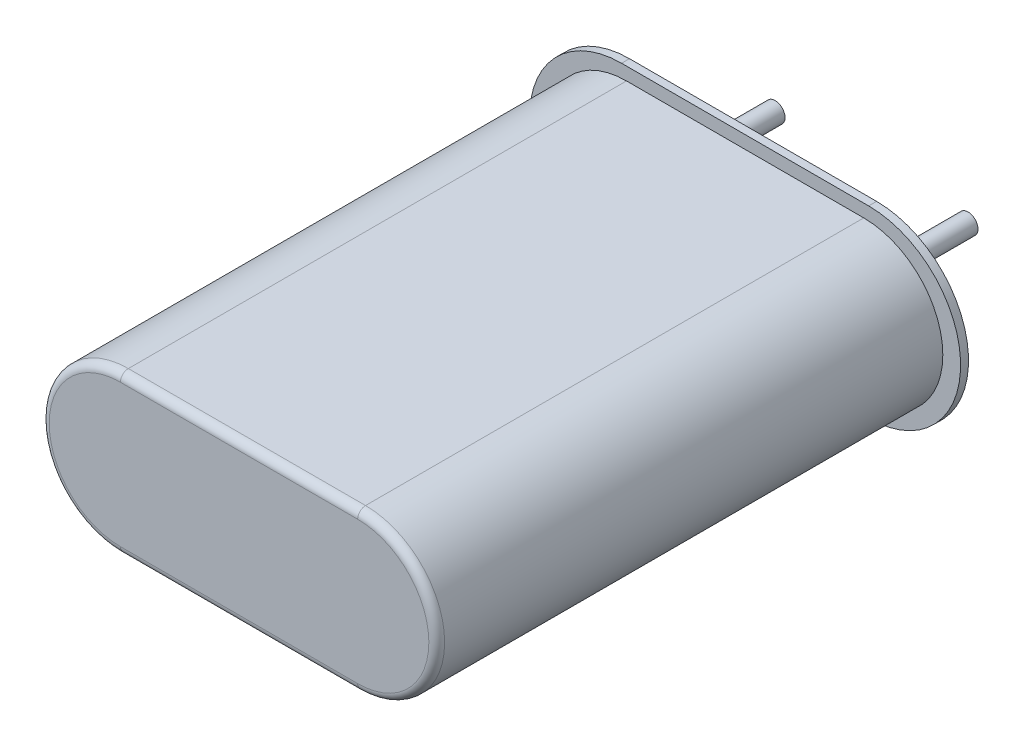
ISO-10303-21;
HEADER;
FILE_DESCRIPTION(('STEP AP214'),'2;1');
FILE_NAME('part.step','',(''),(''),'','','');
FILE_SCHEMA(('AUTOMOTIVE_DESIGN { 1 0 10303 214 1 1 1 1 }'));
ENDSEC;
DATA;
#1=APPLICATION_CONTEXT('core data for automotive mechanical design processes');
#2=APPLICATION_PROTOCOL_DEFINITION('international standard','automotive_design',2000,#1);
#3=PRODUCT_CONTEXT('',#1,'mechanical');
#4=PRODUCT('Part','Part','',(#3));
#5=PRODUCT_RELATED_PRODUCT_CATEGORY('part','',(#4));
#6=PRODUCT_DEFINITION_FORMATION('','',#4);
#7=PRODUCT_DEFINITION_CONTEXT('part definition',#1,'design');
#8=PRODUCT_DEFINITION('design','',#6,#7);
#9=PRODUCT_DEFINITION_SHAPE('','',#8);
#10=(LENGTH_UNIT() NAMED_UNIT(*) SI_UNIT(.MILLI.,.METRE.));
#11=(NAMED_UNIT(*) PLANE_ANGLE_UNIT() SI_UNIT($,.RADIAN.));
#12=(NAMED_UNIT(*) SI_UNIT($,.STERADIAN.) SOLID_ANGLE_UNIT());
#13=UNCERTAINTY_MEASURE_WITH_UNIT(LENGTH_MEASURE(1.E-05),#10,'distance_accuracy_value','');
#14=(GEOMETRIC_REPRESENTATION_CONTEXT(3) GLOBAL_UNCERTAINTY_ASSIGNED_CONTEXT((#13)) GLOBAL_UNIT_ASSIGNED_CONTEXT((#10,
#11,#12)) REPRESENTATION_CONTEXT('',''));
#15=CARTESIAN_POINT('',(0.,0.,0.));
#16=DIRECTION('',(0.,0.,1.));
#17=DIRECTION('',(1.,0.,0.));
#18=AXIS2_PLACEMENT_3D('',#15,#16,#17);
#19=CARTESIAN_POINT('',(0.25,0.,-2.9));
#20=DIRECTION('',(0.,0.,-1.));
#21=DIRECTION('',(-1.,0.,0.));
#22=AXIS2_PLACEMENT_3D('',#19,#20,#21);
#23=PLANE('',#22);
#24=CARTESIAN_POINT('',(0.,0.,-2.9));
#25=DIRECTION('',(0.,0.,1.));
#26=DIRECTION('',(1.,0.,0.));
#27=AXIS2_PLACEMENT_3D('',#24,#25,#26);
#28=CIRCLE('',#27,0.25);
#29=CARTESIAN_POINT('',(0.25,0.,-2.9));
#30=VERTEX_POINT('',#29);
#31=EDGE_CURVE('E284',#30,#30,#28,.T.);
#32=ORIENTED_EDGE('',*,*,#31,.F.);
#33=EDGE_LOOP('',(#32));
#34=FACE_BOUND('',#33,.T.);
#35=ADVANCED_FACE('F17',(#34),#23,.T.);
#36=CARTESIAN_POINT('',(5.13,0.,-2.9));
#37=DIRECTION('',(0.,0.,-1.));
#38=DIRECTION('',(-1.,0.,0.));
#39=AXIS2_PLACEMENT_3D('',#36,#37,#38);
#40=PLANE('',#39);
#41=CARTESIAN_POINT('',(4.88,0.,-2.9));
#42=DIRECTION('',(0.,0.,1.));
#43=DIRECTION('',(1.,0.,0.));
#44=AXIS2_PLACEMENT_3D('',#41,#42,#43);
#45=CIRCLE('',#44,0.25);
#46=CARTESIAN_POINT('',(5.13,0.,-2.9));
#47=VERTEX_POINT('',#46);
#48=EDGE_CURVE('E281',#47,#47,#45,.T.);
#49=ORIENTED_EDGE('',*,*,#48,.F.);
#50=EDGE_LOOP('',(#49));
#51=FACE_BOUND('',#50,.T.);
#52=ADVANCED_FACE('F475',(#51),#40,.T.);
#53=CARTESIAN_POINT('',(0.,0.,0.1));
#54=DIRECTION('',(0.,0.,1.));
#55=DIRECTION('',(1.,0.,0.));
#56=AXIS2_PLACEMENT_3D('',#53,#54,#55);
#57=CYLINDRICAL_SURFACE('',#56,0.25);
#58=CARTESIAN_POINT('',(0.,0.,0.1));
#59=DIRECTION('',(0.,0.,1.));
#60=DIRECTION('',(1.,0.,0.));
#61=AXIS2_PLACEMENT_3D('',#58,#59,#60);
#62=CIRCLE('',#61,0.25);
#63=CARTESIAN_POINT('',(0.25,0.,0.1));
#64=VERTEX_POINT('',#63);
#65=EDGE_CURVE('E278',#64,#64,#62,.F.);
#66=ORIENTED_EDGE('',*,*,#65,.T.);
#67=EDGE_LOOP('',(#66));
#68=FACE_BOUND('',#67,.T.);
#69=ORIENTED_EDGE('',*,*,#31,.T.);
#70=EDGE_LOOP('',(#69));
#71=FACE_BOUND('',#70,.T.);
#72=ADVANCED_FACE('F465',(#68,#71),#57,.T.);
#73=CARTESIAN_POINT('',(4.88,0.,0.1));
#74=DIRECTION('',(0.,0.,1.));
#75=DIRECTION('',(1.,0.,0.));
#76=AXIS2_PLACEMENT_3D('',#73,#74,#75);
#77=CYLINDRICAL_SURFACE('',#76,0.25);
#78=CARTESIAN_POINT('',(4.88,0.,0.1));
#79=DIRECTION('',(0.,0.,1.));
#80=DIRECTION('',(1.,0.,0.));
#81=AXIS2_PLACEMENT_3D('',#78,#79,#80);
#82=CIRCLE('',#81,0.25);
#83=CARTESIAN_POINT('',(5.13,0.,0.1));
#84=VERTEX_POINT('',#83);
#85=EDGE_CURVE('E275',#84,#84,#82,.F.);
#86=ORIENTED_EDGE('',*,*,#85,.T.);
#87=EDGE_LOOP('',(#86));
#88=FACE_BOUND('',#87,.T.);
#89=ORIENTED_EDGE('',*,*,#48,.T.);
#90=EDGE_LOOP('',(#89));
#91=FACE_BOUND('',#90,.T.);
#92=ADVANCED_FACE('F456',(#88,#91),#77,.T.);
#93=CARTESIAN_POINT('',(-0.685,2.325,0.1));
#94=DIRECTION('',(0.,0.,1.));
#95=DIRECTION('',(1.,0.,0.));
#96=AXIS2_PLACEMENT_3D('',#93,#94,#95);
#97=PLANE('',#96);
#98=CARTESIAN_POINT('',(5.565,0.,0.1));
#99=DIRECTION('',(0.,0.,-1.));
#100=DIRECTION('',(-1.,0.,0.));
#101=AXIS2_PLACEMENT_3D('',#98,#99,#100);
#102=CIRCLE('',#101,2.325);
#103=CARTESIAN_POINT('',(5.565,-2.325,0.1));
#104=VERTEX_POINT('',#103);
#105=CARTESIAN_POINT('',(5.565,2.325,0.1));
#106=VERTEX_POINT('',#105);
#107=EDGE_CURVE('E273',#104,#106,#102,.F.);
#108=ORIENTED_EDGE('',*,*,#107,.F.);
#109=DIRECTION('',(1.,0.,0.));
#110=VECTOR('',#109,1.);
#111=CARTESIAN_POINT('',(5.565,-2.325,0.1));
#112=LINE('',#111,#110);
#113=CARTESIAN_POINT('',(-0.685,-2.325,0.1));
#114=VERTEX_POINT('',#113);
#115=EDGE_CURVE('E108',#114,#104,#112,.T.);
#116=ORIENTED_EDGE('',*,*,#115,.F.);
#117=CARTESIAN_POINT('',(-0.685,0.,0.1));
#118=DIRECTION('',(0.,0.,-1.));
#119=DIRECTION('',(-1.,0.,0.));
#120=AXIS2_PLACEMENT_3D('',#117,#118,#119);
#121=CIRCLE('',#120,2.325);
#122=CARTESIAN_POINT('',(-0.685,2.325,0.1));
#123=VERTEX_POINT('',#122);
#124=EDGE_CURVE('E99',#123,#114,#121,.F.);
#125=ORIENTED_EDGE('',*,*,#124,.F.);
#126=DIRECTION('',(1.,0.,0.));
#127=VECTOR('',#126,1.);
#128=CARTESIAN_POINT('',(-0.685,2.325,0.1));
#129=LINE('',#128,#127);
#130=EDGE_CURVE('E105',#106,#123,#129,.F.);
#131=ORIENTED_EDGE('',*,*,#130,.F.);
#132=EDGE_LOOP('',(#108,#116,#125,#131));
#133=FACE_BOUND('',#132,.T.);
#134=ORIENTED_EDGE('',*,*,#85,.F.);
#135=EDGE_LOOP('',(#134));
#136=FACE_BOUND('',#135,.T.);
#137=ORIENTED_EDGE('',*,*,#65,.F.);
#138=EDGE_LOOP('',(#137));
#139=FACE_BOUND('',#138,.T.);
#140=ADVANCED_FACE('F103',(#133,#136,#139),#97,.F.);
#141=CARTESIAN_POINT('',(-0.56,1.8,12.9));
#142=DIRECTION('',(1.,0.,0.));
#143=DIRECTION('',(0.,0.,-1.));
#144=AXIS2_PLACEMENT_3D('',#141,#142,#143);
#145=CYLINDRICAL_SURFACE('',#144,0.2);
#146=CARTESIAN_POINT('',(5.43999999999981,1.8,12.9));
#147=DIRECTION('',(-1.,-1.034727858951E-13,0.));
#148=DIRECTION('',(-1.04083408558608E-13,1.,0.));
#149=AXIS2_PLACEMENT_3D('',#146,#147,#148);
#150=CIRCLE('',#149,0.2);
#151=CARTESIAN_POINT('',(5.43999999999995,2.,12.9));
#152=VERTEX_POINT('',#151);
#153=CARTESIAN_POINT('',(5.43999999999991,1.8,13.1));
#154=VERTEX_POINT('',#153);
#155=EDGE_CURVE('E136',#152,#154,#150,.F.);
#156=ORIENTED_EDGE('',*,*,#155,.F.);
#157=DIRECTION('',(1.,0.,0.));
#158=VECTOR('',#157,1.);
#159=CARTESIAN_POINT('',(-0.56,2.,12.9));
#160=LINE('',#159,#158);
#161=CARTESIAN_POINT('',(-0.56,2.,12.9));
#162=VERTEX_POINT('',#161);
#163=EDGE_CURVE('E129',#162,#152,#160,.T.);
#164=ORIENTED_EDGE('',*,*,#163,.F.);
#165=CARTESIAN_POINT('',(-0.559999999999999,1.8,12.9));
#166=DIRECTION('',(-1.,0.,0.));
#167=DIRECTION('',(0.,1.,0.));
#168=AXIS2_PLACEMENT_3D('',#165,#166,#167);
#169=CIRCLE('',#168,0.2);
#170=CARTESIAN_POINT('',(-0.56,1.8,13.1));
#171=VERTEX_POINT('',#170);
#172=EDGE_CURVE('E120',#171,#162,#169,.T.);
#173=ORIENTED_EDGE('',*,*,#172,.F.);
#174=DIRECTION('',(1.,0.,0.));
#175=VECTOR('',#174,1.);
#176=CARTESIAN_POINT('',(-0.56,1.8,13.1));
#177=LINE('',#176,#175);
#178=EDGE_CURVE('E224',#154,#171,#177,.F.);
#179=ORIENTED_EDGE('',*,*,#178,.F.);
#180=EDGE_LOOP('',(#156,#164,#173,#179));
#181=FACE_BOUND('',#180,.T.);
#182=ADVANCED_FACE('F333',(#181),#145,.T.);
#183=CARTESIAN_POINT('',(-0.685,2.325,0.1));
#184=DIRECTION('',(0.,1.,0.));
#185=DIRECTION('',(0.,0.,1.));
#186=AXIS2_PLACEMENT_3D('',#183,#184,#185);
#187=PLANE('',#186);
#188=DIRECTION('',(0.,0.,-1.));
#189=VECTOR('',#188,1.);
#190=CARTESIAN_POINT('',(5.565,2.325,0.1));
#191=LINE('',#190,#189);
#192=CARTESIAN_POINT('',(5.565,2.325,0.3));
#193=VERTEX_POINT('',#192);
#194=EDGE_CURVE('E118',#106,#193,#191,.F.);
#195=ORIENTED_EDGE('',*,*,#194,.F.);
#196=ORIENTED_EDGE('',*,*,#130,.T.);
#197=DIRECTION('',(0.,0.,-1.));
#198=VECTOR('',#197,1.);
#199=CARTESIAN_POINT('',(-0.685,2.325,0.1));
#200=LINE('',#199,#198);
#201=CARTESIAN_POINT('',(-0.685,2.325,0.3));
#202=VERTEX_POINT('',#201);
#203=EDGE_CURVE('E111',#202,#123,#200,.T.);
#204=ORIENTED_EDGE('',*,*,#203,.F.);
#205=DIRECTION('',(1.,0.,0.));
#206=VECTOR('',#205,1.);
#207=CARTESIAN_POINT('',(-0.685,2.325,0.3));
#208=LINE('',#207,#206);
#209=EDGE_CURVE('E272',#193,#202,#208,.F.);
#210=ORIENTED_EDGE('',*,*,#209,.F.);
#211=EDGE_LOOP('',(#195,#196,#204,#210));
#212=FACE_BOUND('',#211,.T.);
#213=ADVANCED_FACE('F115',(#212),#187,.T.);
#214=CARTESIAN_POINT('',(-0.685,0.,0.1));
#215=DIRECTION('',(0.,0.,-1.));
#216=DIRECTION('',(-1.,0.,0.));
#217=AXIS2_PLACEMENT_3D('',#214,#215,#216);
#218=CYLINDRICAL_SURFACE('',#217,2.325);
#219=CARTESIAN_POINT('',(-0.685,0.,0.3));
#220=DIRECTION('',(0.,0.,-1.));
#221=DIRECTION('',(-1.,0.,0.));
#222=AXIS2_PLACEMENT_3D('',#219,#220,#221);
#223=CIRCLE('',#222,2.325);
#224=CARTESIAN_POINT('',(-0.685,-2.325,0.3));
#225=VERTEX_POINT('',#224);
#226=EDGE_CURVE('E124',#202,#225,#223,.F.);
#227=ORIENTED_EDGE('',*,*,#226,.F.);
#228=ORIENTED_EDGE('',*,*,#203,.T.);
#229=ORIENTED_EDGE('',*,*,#124,.T.);
#230=DIRECTION('',(0.,0.,-1.));
#231=VECTOR('',#230,1.);
#232=CARTESIAN_POINT('',(-0.685,-2.325,0.1));
#233=LINE('',#232,#231);
#234=EDGE_CURVE('E110',#225,#114,#233,.T.);
#235=ORIENTED_EDGE('',*,*,#234,.F.);
#236=EDGE_LOOP('',(#227,#228,#229,#235));
#237=FACE_BOUND('',#236,.T.);
#238=ADVANCED_FACE('F122',(#237),#218,.T.);
#239=CARTESIAN_POINT('',(5.565,-2.325,0.1));
#240=DIRECTION('',(0.,-1.,0.));
#241=DIRECTION('',(0.,0.,-1.));
#242=AXIS2_PLACEMENT_3D('',#239,#240,#241);
#243=PLANE('',#242);
#244=ORIENTED_EDGE('',*,*,#234,.T.);
#245=ORIENTED_EDGE('',*,*,#115,.T.);
#246=DIRECTION('',(0.,0.,-1.));
#247=VECTOR('',#246,1.);
#248=CARTESIAN_POINT('',(5.565,-2.325,0.1));
#249=LINE('',#248,#247);
#250=CARTESIAN_POINT('',(5.565,-2.325,0.3));
#251=VERTEX_POINT('',#250);
#252=EDGE_CURVE('E260',#251,#104,#249,.T.);
#253=ORIENTED_EDGE('',*,*,#252,.F.);
#254=DIRECTION('',(1.,0.,0.));
#255=VECTOR('',#254,1.);
#256=CARTESIAN_POINT('',(-0.685,-2.325,0.3));
#257=LINE('',#256,#255);
#258=EDGE_CURVE('E270',#225,#251,#257,.T.);
#259=ORIENTED_EDGE('',*,*,#258,.F.);
#260=EDGE_LOOP('',(#244,#245,#253,#259));
#261=FACE_BOUND('',#260,.T.);
#262=ADVANCED_FACE('F317',(#261),#243,.T.);
#263=CARTESIAN_POINT('',(5.565,0.,0.1));
#264=DIRECTION('',(0.,0.,-1.));
#265=DIRECTION('',(-1.,0.,0.));
#266=AXIS2_PLACEMENT_3D('',#263,#264,#265);
#267=CYLINDRICAL_SURFACE('',#266,2.325);
#268=CARTESIAN_POINT('',(5.565,0.,0.3));
#269=DIRECTION('',(0.,0.,-1.));
#270=DIRECTION('',(-1.,0.,0.));
#271=AXIS2_PLACEMENT_3D('',#268,#269,#270);
#272=CIRCLE('',#271,2.325);
#273=EDGE_CURVE('E266',#251,#193,#272,.F.);
#274=ORIENTED_EDGE('',*,*,#273,.F.);
#275=ORIENTED_EDGE('',*,*,#252,.T.);
#276=ORIENTED_EDGE('',*,*,#107,.T.);
#277=ORIENTED_EDGE('',*,*,#194,.T.);
#278=EDGE_LOOP('',(#274,#275,#276,#277));
#279=FACE_BOUND('',#278,.T.);
#280=ADVANCED_FACE('F313',(#279),#267,.T.);
#281=CARTESIAN_POINT('',(-0.56,2.,0.1));
#282=DIRECTION('',(0.,1.,0.));
#283=DIRECTION('',(0.,0.,1.));
#284=AXIS2_PLACEMENT_3D('',#281,#282,#283);
#285=PLANE('',#284);
#286=ORIENTED_EDGE('',*,*,#163,.T.);
#287=DIRECTION('',(0.,0.,-1.));
#288=VECTOR('',#287,1.);
#289=CARTESIAN_POINT('',(5.44,2.,0.1));
#290=LINE('',#289,#288);
#291=CARTESIAN_POINT('',(5.44,2.,0.3));
#292=VERTEX_POINT('',#291);
#293=EDGE_CURVE('E132',#292,#152,#290,.F.);
#294=ORIENTED_EDGE('',*,*,#293,.F.);
#295=DIRECTION('',(1.,0.,0.));
#296=VECTOR('',#295,1.);
#297=CARTESIAN_POINT('',(-0.685,2.,0.3));
#298=LINE('',#297,#296);
#299=CARTESIAN_POINT('',(-0.56,2.,0.3));
#300=VERTEX_POINT('',#299);
#301=EDGE_CURVE('E269',#300,#292,#298,.T.);
#302=ORIENTED_EDGE('',*,*,#301,.F.);
#303=DIRECTION('',(0.,0.,-1.));
#304=VECTOR('',#303,1.);
#305=CARTESIAN_POINT('',(-0.56,2.,0.1));
#306=LINE('',#305,#304);
#307=EDGE_CURVE('E297',#162,#300,#306,.T.);
#308=ORIENTED_EDGE('',*,*,#307,.F.);
#309=EDGE_LOOP('',(#286,#294,#302,#308));
#310=FACE_BOUND('',#309,.T.);
#311=ADVANCED_FACE('F242',(#310),#285,.T.);
#312=CARTESIAN_POINT('',(5.44,0.,12.9));
#313=DIRECTION('',(0.,0.,1.));
#314=DIRECTION('',(1.,0.,0.));
#315=AXIS2_PLACEMENT_3D('',#312,#313,#314);
#316=TOROIDAL_SURFACE('',#315,1.8,0.2);
#317=CARTESIAN_POINT('',(5.44,0.,12.9));
#318=DIRECTION('',(0.,0.,-1.));
#319=DIRECTION('',(-1.,0.,0.));
#320=AXIS2_PLACEMENT_3D('',#317,#318,#319);
#321=CIRCLE('',#320,2.);
#322=CARTESIAN_POINT('',(5.44,-2.,12.9));
#323=VERTEX_POINT('',#322);
#324=EDGE_CURVE('E236',#152,#323,#321,.T.);
#325=ORIENTED_EDGE('',*,*,#324,.F.);
#326=ORIENTED_EDGE('',*,*,#155,.T.);
#327=CARTESIAN_POINT('',(5.44,1.8,13.1));
#328=CARTESIAN_POINT('',(5.45963495800253,1.80000012349202,13.1));
#329=CARTESIAN_POINT('',(5.47926990900287,1.79967872823186,13.1));
#330=CARTESIAN_POINT('',(5.51851878915552,1.79839378668306,13.1));
#331=CARTESIAN_POINT('',(5.53813271830782,1.79743024039442,13.1));
#332=CARTESIAN_POINT('',(5.57731854692069,1.79486188326455,13.1));
#333=CARTESIAN_POINT('',(5.59689044638126,1.79325707242332,13.1));
#334=CARTESIAN_POINT('',(5.63597125880515,1.78940794359659,13.1));
#335=CARTESIAN_POINT('',(5.65548017176848,1.78716362561108,13.1));
#336=CARTESIAN_POINT('',(5.69441412022369,1.78203787533464,13.1));
#337=CARTESIAN_POINT('',(5.71383915571559,1.77915644304372,13.1));
#338=CARTESIAN_POINT('',(5.75258454850491,1.77275955246185,13.1));
#339=CARTESIAN_POINT('',(5.77190490580234,1.76924409417091,13.1));
#340=CARTESIAN_POINT('',(5.8104202534557,1.76158291528073,13.1));
#341=CARTESIAN_POINT('',(5.82961524381162,1.7574371946815,13.1));
#342=CARTESIAN_POINT('',(5.86785930311209,1.74851993071691,13.1));
#343=CARTESIAN_POINT('',(5.88690837205663,1.74374838735156,13.1));
#344=CARTESIAN_POINT('',(5.92484019031241,1.7335845872891,13.1));
#345=CARTESIAN_POINT('',(5.94372293962365,1.728192330592,13.1));
#346=CARTESIAN_POINT('',(5.98130189849238,1.71679287804398,13.1));
#347=CARTESIAN_POINT('',(5.99999810804986,1.71078568219306,13.1));
#348=CARTESIAN_POINT('',(6.03718396704148,1.69816278398935,13.1));
#349=CARTESIAN_POINT('',(6.05567361647563,1.69154708163657,13.1));
#350=CARTESIAN_POINT('',(6.09242655604077,1.67771425468984,13.1));
#351=CARTESIAN_POINT('',(6.11068984617177,1.6704971300959,13.1));
#352=CARTESIAN_POINT('',(6.14697051034252,1.65546918694477,13.1));
#353=CARTESIAN_POINT('',(6.16498788438227,1.64765836838759,13.1));
#354=CARTESIAN_POINT('',(6.20075742291351,1.63145140132868,13.1));
#355=CARTESIAN_POINT('',(6.218509587405,1.62305525282696,13.1));
#356=CARTESIAN_POINT('',(6.25372969738336,1.60568661669077,13.1));
#357=CARTESIAN_POINT('',(6.27119764287024,1.59671412905632,13.1));
#358=CARTESIAN_POINT('',(6.30583060970331,1.57820242259781,13.1));
#359=CARTESIAN_POINT('',(6.32299563104949,1.56866320377376,13.1));
#360=CARTESIAN_POINT('',(6.35700436895046,1.54902824985029,13.1));
#361=CARTESIAN_POINT('',(6.37384808550524,1.53893251475088,13.1));
#362=CARTESIAN_POINT('',(6.40719617683604,1.51819533874487,13.1));
#363=CARTESIAN_POINT('',(6.42370055161206,1.50755389783827,13.1));
#364=CARTESIAN_POINT('',(6.45635228725847,1.48573670645098,13.1));
#365=CARTESIAN_POINT('',(6.47249964812886,1.47456095597029,13.1));
#366=CARTESIAN_POINT('',(6.50442006059519,1.45168710855962,13.1));
#367=CARTESIAN_POINT('',(6.52019311219114,1.43998901162963,13.0999999999998));
#368=CARTESIAN_POINT('',(6.55134803224022,1.41608301341891,13.1000000000002));
#369=CARTESIAN_POINT('',(6.56672990069334,1.40387511213817,13.1000000000006));
#370=CARTESIAN_POINT('',(6.59708592229574,1.37896251996779,13.0999999999994));
#371=CARTESIAN_POINT('',(6.61206007544502,1.36625782907816,13.0999999999978));
#372=CARTESIAN_POINT('',(6.6415848589152,1.34036547784627,13.1000000000022));
#373=CARTESIAN_POINT('',(6.65613548923611,1.32717781750402,13.1000000000081));
#374=CARTESIAN_POINT('',(6.6847967980462,1.30033284420831,13.0999999999919));
#375=CARTESIAN_POINT('',(6.69890747653537,1.28667553125487,13.0999999999696));
#376=CARTESIAN_POINT('',(6.72724515599509,1.25834071823507,13.1000000000316));
#377=CARTESIAN_POINT('',(6.74145328503402,1.24364434095205,13.1000000001202));
#378=CARTESIAN_POINT('',(6.76936664945018,1.21378210469612,13.0999999992759));
#379=CARTESIAN_POINT('',(6.78307189432153,1.19861625459652,13.099999998343));
#380=CARTESIAN_POINT('',(6.80996320989801,1.16783120647467,13.0999999919936));
#381=CARTESIAN_POINT('',(6.82314928400341,1.15221201142274,13.0999999865771));
#382=CARTESIAN_POINT('',(6.84898798671013,1.12053827772625,13.099999964502));
#383=CARTESIAN_POINT('',(6.86164061222382,1.10448373656276,13.0999999478434));
#384=CARTESIAN_POINT('',(6.88639705158401,1.07195654723834,13.0999998975421));
#385=CARTESIAN_POINT('',(6.89850085547981,1.05548389150499,13.099999863899));
#386=CARTESIAN_POINT('',(6.9221501818031,1.02214176873895,13.0999997586238));
#387=CARTESIAN_POINT('',(6.93369568721489,1.00527228963522,13.0999996869905));
#388=CARTESIAN_POINT('',(6.95618731533053,0.971164434130932,13.0999995303618));
#389=CARTESIAN_POINT('',(6.96713407819236,0.953926480258262,13.099999445381));
#390=CARTESIAN_POINT('',(6.98841185823829,0.919076004333276,13.0999993321937));
#391=CARTESIAN_POINT('',(6.99874291138481,0.901463504239169,13.0999993039839));
#392=CARTESIAN_POINT('',(7.01878140690653,0.865889365732708,13.0999993055007));
#393=CARTESIAN_POINT('',(7.02848890775583,0.847927760264348,13.0999993352219));
#394=CARTESIAN_POINT('',(7.04726363300455,0.811676248065802,13.0999994428159));
#395=CARTESIAN_POINT('',(7.05633094006695,0.793386384104854,13.0999995206825));
#396=CARTESIAN_POINT('',(7.0738270751636,0.756506609137053,13.0999996973271));
#397=CARTESIAN_POINT('',(7.08225600817693,0.737916748076616,13.0999997961016));
#398=CARTESIAN_POINT('',(7.0984172834532,0.700442721923547,13.0999999378136));
#399=CARTESIAN_POINT('',(7.10614976487663,0.681558616513454,13.0999999807622));
#400=CARTESIAN_POINT('',(7.12358754683563,0.637228293189778,13.1000000256754));
#401=CARTESIAN_POINT('',(7.13308714256268,0.611700799487323,13.1000000091162));
#402=CARTESIAN_POINT('',(7.1516657127479,0.557990041814628,13.099999984089));
#403=CARTESIAN_POINT('',(7.16063620142603,0.529768934206191,13.0999999764503));
#404=CARTESIAN_POINT('',(7.17487325676914,0.480866739807594,13.0999999400993));
#405=CARTESIAN_POINT('',(7.18047442867017,0.460282003198283,13.0999999178713));
#406=CARTESIAN_POINT('',(7.19030422381167,0.421406940926259,13.0999998787204));
#407=CARTESIAN_POINT('',(7.19461689831461,0.403137925035973,13.099999861481));
#408=CARTESIAN_POINT('',(7.2021113882195,0.368975090709842,13.0999998381396));
#409=CARTESIAN_POINT('',(7.20536721124609,0.353097440191182,13.0999998308385));
#410=CARTESIAN_POINT('',(7.21193657248249,0.31866782269855,13.099999824741));
#411=CARTESIAN_POINT('',(7.21517327947674,0.300101135010576,13.0999998275219));
#412=CARTESIAN_POINT('',(7.22105781824735,0.262875291423788,13.0999998384726));
#413=CARTESIAN_POINT('',(7.22370566426017,0.244216137771607,13.0999998466423));
#414=CARTESIAN_POINT('',(7.22840857504641,0.206823850241367,13.0999998685186));
#415=CARTESIAN_POINT('',(7.23046365935657,0.188090718822164,13.0999998822251));
#416=CARTESIAN_POINT('',(7.23397936126115,0.150569560438288,13.0999999118443));
#417=CARTESIAN_POINT('',(7.23544000366899,0.13178153579797,13.0999999277568));
#418=CARTESIAN_POINT('',(7.23776527987637,0.0941695893787015,13.0999999578573));
#419=CARTESIAN_POINT('',(7.23862994378925,0.0753456694616521,13.0999999720454));
#420=CARTESIAN_POINT('',(7.23976260059385,0.0376810056113127,13.0999999930061));
#421=CARTESIAN_POINT('',(7.24003062887503,0.0188402627421978,13.0999999997791));
#422=CARTESIAN_POINT('',(7.24,0.,13.1));
#423=B_SPLINE_CURVE_WITH_KNOTS('',3,(#327,#328,#329,#330,#331,#332,#333,#334,#335,#336,#337,
#338,#339,#340,#341,#342,#343,#344,#345,#346,#347,#348,#349,#350,#351,#352,#353,#354,#355,#356,
#357,#358,#359,#360,#361,#362,#363,#364,#365,#366,#367,#368,#369,#370,#371,#372,#373,#374,#375,
#376,#377,#378,#379,#380,#381,#382,#383,#384,#385,#386,#387,#388,#389,#390,#391,#392,#393,#394,
#395,#396,#397,#398,#399,#400,#401,#402,#403,#404,#405,#406,#407,#408,#409,#410,#411,#412,#413,
#414,#415,#416,#417,#418,#419,#420,#421,#422),.UNSPECIFIED.,.F.,.F.,(4,2,2,2,2,2,2,2,2,2,2,2,2,
2,2,2,2,2,2,2,2,2,2,2,2,2,2,2,2,2,2,2,2,2,2,2,2,2,2,2,2,2,2,2,2,2,2,4),(0.,0.05890223385535,
0.117804467710701,0.176706701566051,0.235608935421401,0.29451116927675,0.353413403132101,
0.412315636987452,0.471217870842801,0.530120104698153,0.589022338553502,0.647924572408853,
0.706826806264203,0.765729040119554,0.824631273974904,0.883533507830254,0.942435741685605,
1.00133797554096,1.06024020939631,1.11914244325166,1.17804467710701,1.23694691096236,
1.29584914481771,1.35475137867306,1.41365361252841,1.47496636812495,1.5362779655813,
1.59758916141434,1.65890071207011,1.72021337392281,1.78152790327332,1.84277554126476,
1.90401959838738,1.96525790389163,2.02648828767922,2.08770858031422,2.14891661303765,
2.23060683050472,2.31940367493145,2.38339101233691,2.43969457943325,2.48831293597594,
2.54484322871139,2.60137215460725,2.65789921716134,2.71442391989851,2.77094576637084,
2.82746426015798),.UNSPECIFIED.);
#424=CARTESIAN_POINT('',(7.24,0.,13.1));
#425=VERTEX_POINT('',#424);
#426=EDGE_CURVE('E220',#425,#154,#423,.F.);
#427=ORIENTED_EDGE('',*,*,#426,.F.);
#428=CARTESIAN_POINT('',(5.44,0.,13.1));
#429=DIRECTION('',(0.,0.,-1.));
#430=DIRECTION('',(1.,0.,0.));
#431=AXIS2_PLACEMENT_3D('',#428,#429,#430);
#432=CIRCLE('',#431,1.8);
#433=CARTESIAN_POINT('',(5.44,-1.8,13.1));
#434=VERTEX_POINT('',#433);
#435=EDGE_CURVE('E210',#434,#425,#432,.F.);
#436=ORIENTED_EDGE('',*,*,#435,.F.);
#437=CARTESIAN_POINT('',(5.44,-1.8,12.9));
#438=DIRECTION('',(1.,0.,0.));
#439=DIRECTION('',(0.,-1.,0.));
#440=AXIS2_PLACEMENT_3D('',#437,#438,#439);
#441=CIRCLE('',#440,0.2);
#442=EDGE_CURVE('E231',#434,#323,#441,.T.);
#443=ORIENTED_EDGE('',*,*,#442,.T.);
#444=EDGE_LOOP('',(#325,#326,#427,#436,#443));
#445=FACE_BOUND('',#444,.T.);
#446=ADVANCED_FACE('F238',(#445),#316,.T.);
#447=CARTESIAN_POINT('',(-0.56,2.,13.1));
#448=DIRECTION('',(0.,0.,1.));
#449=DIRECTION('',(1.,0.,0.));
#450=AXIS2_PLACEMENT_3D('',#447,#448,#449);
#451=PLANE('',#450);
#452=ORIENTED_EDGE('',*,*,#435,.T.);
#453=ORIENTED_EDGE('',*,*,#426,.T.);
#454=ORIENTED_EDGE('',*,*,#178,.T.);
#455=CARTESIAN_POINT('',(-2.36,0.,13.1));
#456=CARTESIAN_POINT('',(-2.36000012349202,0.019634958002527,13.1));
#457=CARTESIAN_POINT('',(-2.35967872823186,0.0392699090028739,13.1));
#458=CARTESIAN_POINT('',(-2.35839378668306,0.0785187891555222,13.1));
#459=CARTESIAN_POINT('',(-2.35743024039442,0.0981327183078236,13.1));
#460=CARTESIAN_POINT('',(-2.35486188326455,0.137318546920694,13.1));
#461=CARTESIAN_POINT('',(-2.35325707242332,0.156890446381263,13.1));
#462=CARTESIAN_POINT('',(-2.34940794359659,0.195971258805157,13.1));
#463=CARTESIAN_POINT('',(-2.34716362561108,0.215480171768482,13.1));
#464=CARTESIAN_POINT('',(-2.34203787533464,0.254414120223703,13.1));
#465=CARTESIAN_POINT('',(-2.33915644304372,0.273839155715598,13.1));
#466=CARTESIAN_POINT('',(-2.33275955246185,0.312584548504922,13.1));
#467=CARTESIAN_POINT('',(-2.3292440941709,0.331904905802352,13.1));
#468=CARTESIAN_POINT('',(-2.32158291528073,0.37042025345571,13.1));
#469=CARTESIAN_POINT('',(-2.31743719468149,0.389615243811638,13.1));
#470=CARTESIAN_POINT('',(-2.30851993071691,0.427859303112106,13.1));
#471=CARTESIAN_POINT('',(-2.30374838735155,0.446908372056646,13.1));
#472=CARTESIAN_POINT('',(-2.29358458728909,0.484840190312428,13.1));
#473=CARTESIAN_POINT('',(-2.28819233059199,0.50372293962367,13.1));
#474=CARTESIAN_POINT('',(-2.27679287804396,0.541301898492395,13.1));
#475=CARTESIAN_POINT('',(-2.27078568219304,0.559998108049878,13.1));
#476=CARTESIAN_POINT('',(-2.25816278398934,0.597183967041506,13.1));
#477=CARTESIAN_POINT('',(-2.25154708163655,0.615673616475651,13.1));
#478=CARTESIAN_POINT('',(-2.23771425468982,0.652426556040792,13.1));
#479=CARTESIAN_POINT('',(-2.23049713009588,0.670689846171787,13.1));
#480=CARTESIAN_POINT('',(-2.21546918694475,0.706970510342536,13.1));
#481=CARTESIAN_POINT('',(-2.20765836838757,0.72498788438229,13.1));
#482=CARTESIAN_POINT('',(-2.19145140132866,0.760757422913532,13.1));
#483=CARTESIAN_POINT('',(-2.18305525282693,0.77850958740502,13.1));
#484=CARTESIAN_POINT('',(-2.16568661669075,0.813729697383386,13.1));
#485=CARTESIAN_POINT('',(-2.1567141290563,0.831197642870264,13.1));
#486=CARTESIAN_POINT('',(-2.13820242259778,0.865830609703329,13.1));
#487=CARTESIAN_POINT('',(-2.12866320377372,0.882995631049517,13.1));
#488=CARTESIAN_POINT('',(-2.10902824985026,0.917004368950485,13.1));
#489=CARTESIAN_POINT('',(-2.09893251475085,0.933848085505264,13.1));
#490=CARTESIAN_POINT('',(-2.07819533874484,0.967196176836062,13.1));
#491=CARTESIAN_POINT('',(-2.06755389783823,0.983700551612081,13.1));
#492=CARTESIAN_POINT('',(-2.04573670645093,1.01635228725849,13.1));
#493=CARTESIAN_POINT('',(-2.03456095597024,1.03249964812888,13.1));
#494=CARTESIAN_POINT('',(-2.01168710855957,1.06442006059521,13.1));
#495=CARTESIAN_POINT('',(-1.99998901162959,1.08019311219116,13.0999999999998));
#496=CARTESIAN_POINT('',(-1.97608301341886,1.11134803224023,13.1000000000002));
#497=CARTESIAN_POINT('',(-1.96387511213812,1.12672990069336,13.1000000000006));
#498=CARTESIAN_POINT('',(-1.93896251996774,1.15708592229576,13.0999999999994));
#499=CARTESIAN_POINT('',(-1.9262578290781,1.17206007544503,13.0999999999978));
#500=CARTESIAN_POINT('',(-1.90036547784621,1.20158485891522,13.1000000000022));
#501=CARTESIAN_POINT('',(-1.88717781750396,1.21613548923613,13.1000000000081));
#502=CARTESIAN_POINT('',(-1.86033284420825,1.24479679804621,13.0999999999919));
#503=CARTESIAN_POINT('',(-1.8466755312548,1.25890747653539,13.0999999999696));
#504=CARTESIAN_POINT('',(-1.818340718235,1.28724515599512,13.1000000000316));
#505=CARTESIAN_POINT('',(-1.80364434095196,1.30145328503406,13.1000000001202));
#506=CARTESIAN_POINT('',(-1.773782104696,1.32936664945023,13.0999999992759));
#507=CARTESIAN_POINT('',(-1.75861625459638,1.34307189432159,13.099999998343));
#508=CARTESIAN_POINT('',(-1.7278312064745,1.36996320989808,13.0999999919936));
#509=CARTESIAN_POINT('',(-1.71221201142255,1.38314928400348,13.0999999865771));
#510=CARTESIAN_POINT('',(-1.68053827772602,1.40898798671021,13.099999964502));
#511=CARTESIAN_POINT('',(-1.66448373656252,1.42164061222391,13.0999999478434));
#512=CARTESIAN_POINT('',(-1.63195654723805,1.4463970515841,13.0999998975421));
#513=CARTESIAN_POINT('',(-1.61548389150468,1.45850085547989,13.099999863899));
#514=CARTESIAN_POINT('',(-1.5821417687386,1.48215018180318,13.0999997586238));
#515=CARTESIAN_POINT('',(-1.56527228963485,1.49369568721497,13.0999996869905));
#516=CARTESIAN_POINT('',(-1.53116443413055,1.51618731533058,13.0999995303618));
#517=CARTESIAN_POINT('',(-1.51392648025789,1.52713407819239,13.099999445381));
#518=CARTESIAN_POINT('',(-1.47907600433294,1.54841185823828,13.0999993321937));
#519=CARTESIAN_POINT('',(-1.46146350423885,1.55874291138478,13.0999993039839));
#520=CARTESIAN_POINT('',(-1.42588936573242,1.57878140690648,13.0999993055007));
#521=CARTESIAN_POINT('',(-1.40792776026408,1.58848890775577,13.0999993352219));
#522=CARTESIAN_POINT('',(-1.37167624806558,1.60726363300448,13.0999994428159));
#523=CARTESIAN_POINT('',(-1.35338638410466,1.61633094006689,13.0999995206825));
#524=CARTESIAN_POINT('',(-1.31650660913689,1.63382707516353,13.0999996973271));
#525=CARTESIAN_POINT('',(-1.29791674807647,1.64225600817685,13.0999997961016));
#526=CARTESIAN_POINT('',(-1.26044272192347,1.6584172834532,13.0999999378136));
#527=CARTESIAN_POINT('',(-1.24155861651344,1.66614976487674,13.0999999807622));
#528=CARTESIAN_POINT('',(-1.19722829315192,1.68358754685036,13.1000000256754));
#529=CARTESIAN_POINT('',(-1.17170079941095,1.69308714259035,13.1000000091162));
#530=CARTESIAN_POINT('',(-1.11799004173699,1.71166571277187,13.099999984089));
#531=CARTESIAN_POINT('',(-1.08976893416714,1.72063620143712,13.0999999764503));
#532=CARTESIAN_POINT('',(-1.04086674004599,1.73487325669997,13.0999999400993));
#533=CARTESIAN_POINT('',(-1.02028200367742,1.74047442854017,13.0999999178713));
#534=CARTESIAN_POINT('',(-0.981406941650056,1.75030422363698,13.0999998787204));
#535=CARTESIAN_POINT('',(-0.963137925761549,1.75461689814742,13.099999861481));
#536=CARTESIAN_POINT('',(-0.928975091196149,1.76211138811967,13.0999998381396));
#537=CARTESIAN_POINT('',(-0.91309744043502,1.76536721119946,13.0999998308385));
#538=CARTESIAN_POINT('',(-0.878667822698663,1.77193657248264,13.099999824741));
#539=CARTESIAN_POINT('',(-0.860101135010725,1.77517327947719,13.0999998275219));
#540=CARTESIAN_POINT('',(-0.822875291423962,1.7810578182482,13.0999998384726));
#541=CARTESIAN_POINT('',(-0.804216137771769,1.78370566426114,13.0999998466423));
#542=CARTESIAN_POINT('',(-0.766823850241501,1.78840857504753,13.0999998685186));
#543=CARTESIAN_POINT('',(-0.748090718822282,1.79046365935775,13.0999998822251));
#544=CARTESIAN_POINT('',(-0.71056956043837,1.79397936126233,13.0999999118443));
#545=CARTESIAN_POINT('',(-0.691781535798032,1.79544000367012,13.0999999277568));
#546=CARTESIAN_POINT('',(-0.654169589378729,1.79776527987732,13.0999999578573));
#547=CARTESIAN_POINT('',(-0.635345669461665,1.79862994379008,13.0999999720454));
#548=CARTESIAN_POINT('',(-0.597681005611311,1.79976260059432,13.0999999930061));
#549=CARTESIAN_POINT('',(-0.578840262742195,1.80003062887529,13.0999999997791));
#550=CARTESIAN_POINT('',(-0.56,1.8,13.1));
#551=B_SPLINE_CURVE_WITH_KNOTS('',3,(#455,#456,#457,#458,#459,#460,#461,#462,#463,#464,#465,
#466,#467,#468,#469,#470,#471,#472,#473,#474,#475,#476,#477,#478,#479,#480,#481,#482,#483,#484,
#485,#486,#487,#488,#489,#490,#491,#492,#493,#494,#495,#496,#497,#498,#499,#500,#501,#502,#503,
#504,#505,#506,#507,#508,#509,#510,#511,#512,#513,#514,#515,#516,#517,#518,#519,#520,#521,#522,
#523,#524,#525,#526,#527,#528,#529,#530,#531,#532,#533,#534,#535,#536,#537,#538,#539,#540,#541,
#542,#543,#544,#545,#546,#547,#548,#549,#550),.UNSPECIFIED.,.F.,.F.,(4,2,2,2,2,2,2,2,2,2,2,2,2,
2,2,2,2,2,2,2,2,2,2,2,2,2,2,2,2,2,2,2,2,2,2,2,2,2,2,2,2,2,2,2,2,2,2,4),(0.,0.0589022338553527,
0.117804467710705,0.176706701566058,0.235608935421408,0.294511169276762,0.353413403132113,
0.412315636987468,0.471217870842817,0.530120104698172,0.589022338553524,0.647924572408877,
0.706826806264228,0.765729040119581,0.824631273974934,0.883533507830286,0.942435741685639,
1.00133797554099,1.06024020939634,1.1191424432517,1.17804467710705,1.2369469109624,
1.29584914481775,1.3547513786731,1.41365361252846,1.47496636812504,1.53627796558145,
1.59758916141453,1.65890071207035,1.72021337392311,1.78152790327367,1.84277554126503,
1.90401959838759,1.96525790389177,2.02648828767931,2.08770858031425,2.14891661303763,
2.23060683062643,2.3194036749313,2.38339101159245,2.43969457868875,2.4883129359758,
2.54484322871132,2.60137215460725,2.65789921716141,2.71442391989863,2.77094576637097,
2.82746426015811),.UNSPECIFIED.);
#552=CARTESIAN_POINT('',(-2.36,0.,13.1));
#553=VERTEX_POINT('',#552);
#554=EDGE_CURVE('E187',#171,#553,#551,.F.);
#555=ORIENTED_EDGE('',*,*,#554,.T.);
#556=CARTESIAN_POINT('',(-0.56,0.,13.1));
#557=DIRECTION('',(0.,0.,-1.));
#558=DIRECTION('',(0.,-1.,0.));
#559=AXIS2_PLACEMENT_3D('',#556,#557,#558);
#560=CIRCLE('',#559,1.8);
#561=CARTESIAN_POINT('',(-0.56,-1.8,13.1));
#562=VERTEX_POINT('',#561);
#563=EDGE_CURVE('E142',#562,#553,#560,.T.);
#564=ORIENTED_EDGE('',*,*,#563,.F.);
#565=DIRECTION('',(-1.,0.,0.));
#566=VECTOR('',#565,1.);
#567=CARTESIAN_POINT('',(5.44,-1.8,13.1));
#568=LINE('',#567,#566);
#569=EDGE_CURVE('E171',#434,#562,#568,.T.);
#570=ORIENTED_EDGE('',*,*,#569,.F.);
#571=EDGE_LOOP('',(#452,#453,#454,#555,#564,#570));
#572=FACE_BOUND('',#571,.T.);
#573=ADVANCED_FACE('F160',(#572),#451,.T.);
#574=CARTESIAN_POINT('',(-0.56,0.,12.9));
#575=DIRECTION('',(0.,0.,1.));
#576=DIRECTION('',(1.03722007834447E-13,-1.,0.));
#577=AXIS2_PLACEMENT_3D('',#574,#575,#576);
#578=TOROIDAL_SURFACE('',#577,1.8,0.2);
#579=CARTESIAN_POINT('',(-0.56,0.,12.9));
#580=DIRECTION('',(0.,0.,-1.));
#581=DIRECTION('',(-1.,0.,0.));
#582=AXIS2_PLACEMENT_3D('',#579,#580,#581);
#583=CIRCLE('',#582,2.);
#584=CARTESIAN_POINT('',(-0.56,-2.,12.9));
#585=VERTEX_POINT('',#584);
#586=EDGE_CURVE('E37',#585,#162,#583,.T.);
#587=ORIENTED_EDGE('',*,*,#586,.F.);
#588=CARTESIAN_POINT('',(-0.56,-1.8,12.9));
#589=DIRECTION('',(-1.,0.,0.));
#590=DIRECTION('',(0.,0.,1.));
#591=AXIS2_PLACEMENT_3D('',#588,#589,#590);
#592=CIRCLE('',#591,0.2);
#593=EDGE_CURVE('E169',#562,#585,#592,.F.);
#594=ORIENTED_EDGE('',*,*,#593,.F.);
#595=ORIENTED_EDGE('',*,*,#563,.T.);
#596=ORIENTED_EDGE('',*,*,#554,.F.);
#597=ORIENTED_EDGE('',*,*,#172,.T.);
#598=EDGE_LOOP('',(#587,#594,#595,#596,#597));
#599=FACE_BOUND('',#598,.T.);
#600=ADVANCED_FACE('F148',(#599),#578,.T.);
#601=CARTESIAN_POINT('',(-0.685,2.325,0.3));
#602=DIRECTION('',(0.,0.,1.));
#603=DIRECTION('',(1.,0.,0.));
#604=AXIS2_PLACEMENT_3D('',#601,#602,#603);
#605=PLANE('',#604);
#606=ORIENTED_EDGE('',*,*,#301,.T.);
#607=CARTESIAN_POINT('',(5.44,0.,0.3));
#608=DIRECTION('',(0.,0.,-1.));
#609=DIRECTION('',(-1.,0.,0.));
#610=AXIS2_PLACEMENT_3D('',#607,#608,#609);
#611=CIRCLE('',#610,2.);
#612=CARTESIAN_POINT('',(5.44,-2.,0.3));
#613=VERTEX_POINT('',#612);
#614=EDGE_CURVE('E181',#613,#292,#611,.F.);
#615=ORIENTED_EDGE('',*,*,#614,.F.);
#616=DIRECTION('',(1.,0.,0.));
#617=VECTOR('',#616,1.);
#618=CARTESIAN_POINT('',(5.44,-2.,0.3));
#619=LINE('',#618,#617);
#620=CARTESIAN_POINT('',(-0.56,-2.,0.3));
#621=VERTEX_POINT('',#620);
#622=EDGE_CURVE('E264',#621,#613,#619,.T.);
#623=ORIENTED_EDGE('',*,*,#622,.F.);
#624=CARTESIAN_POINT('',(-0.56,0.,0.3));
#625=DIRECTION('',(0.,0.,-1.));
#626=DIRECTION('',(-1.,0.,0.));
#627=AXIS2_PLACEMENT_3D('',#624,#625,#626);
#628=CIRCLE('',#627,2.);
#629=EDGE_CURVE('E261',#300,#621,#628,.F.);
#630=ORIENTED_EDGE('',*,*,#629,.F.);
#631=EDGE_LOOP('',(#606,#615,#623,#630));
#632=FACE_BOUND('',#631,.T.);
#633=ORIENTED_EDGE('',*,*,#258,.T.);
#634=ORIENTED_EDGE('',*,*,#273,.T.);
#635=ORIENTED_EDGE('',*,*,#209,.T.);
#636=ORIENTED_EDGE('',*,*,#226,.T.);
#637=EDGE_LOOP('',(#633,#634,#635,#636));
#638=FACE_BOUND('',#637,.T.);
#639=ADVANCED_FACE('F159',(#632,#638),#605,.T.);
#640=CARTESIAN_POINT('',(5.44,0.,0.1));
#641=DIRECTION('',(0.,0.,-1.));
#642=DIRECTION('',(-1.,0.,0.));
#643=AXIS2_PLACEMENT_3D('',#640,#641,#642);
#644=CYLINDRICAL_SURFACE('',#643,2.);
#645=DIRECTION('',(0.,0.,-1.));
#646=VECTOR('',#645,1.);
#647=CARTESIAN_POINT('',(5.44,-2.,0.1));
#648=LINE('',#647,#646);
#649=EDGE_CURVE('E176',#613,#323,#648,.F.);
#650=ORIENTED_EDGE('',*,*,#649,.F.);
#651=ORIENTED_EDGE('',*,*,#614,.T.);
#652=ORIENTED_EDGE('',*,*,#293,.T.);
#653=ORIENTED_EDGE('',*,*,#324,.T.);
#654=EDGE_LOOP('',(#650,#651,#652,#653));
#655=FACE_BOUND('',#654,.T.);
#656=ADVANCED_FACE('F343',(#655),#644,.T.);
#657=CARTESIAN_POINT('',(5.44,-1.8,12.9));
#658=DIRECTION('',(-1.,0.,0.));
#659=DIRECTION('',(0.,0.,1.));
#660=AXIS2_PLACEMENT_3D('',#657,#658,#659);
#661=CYLINDRICAL_SURFACE('',#660,0.2);
#662=ORIENTED_EDGE('',*,*,#593,.T.);
#663=DIRECTION('',(1.,0.,0.));
#664=VECTOR('',#663,1.);
#665=CARTESIAN_POINT('',(5.44,-2.,12.9));
#666=LINE('',#665,#664);
#667=EDGE_CURVE('E28',#323,#585,#666,.F.);
#668=ORIENTED_EDGE('',*,*,#667,.F.);
#669=ORIENTED_EDGE('',*,*,#442,.F.);
#670=ORIENTED_EDGE('',*,*,#569,.T.);
#671=EDGE_LOOP('',(#662,#668,#669,#670));
#672=FACE_BOUND('',#671,.T.);
#673=ADVANCED_FACE('F345',(#672),#661,.T.);
#674=CARTESIAN_POINT('',(-0.56,0.,0.1));
#675=DIRECTION('',(0.,0.,-1.));
#676=DIRECTION('',(-1.,0.,0.));
#677=AXIS2_PLACEMENT_3D('',#674,#675,#676);
#678=CYLINDRICAL_SURFACE('',#677,2.);
#679=ORIENTED_EDGE('',*,*,#586,.T.);
#680=ORIENTED_EDGE('',*,*,#307,.T.);
#681=ORIENTED_EDGE('',*,*,#629,.T.);
#682=DIRECTION('',(0.,0.,-1.));
#683=VECTOR('',#682,1.);
#684=CARTESIAN_POINT('',(-0.56,-2.,0.1));
#685=LINE('',#684,#683);
#686=EDGE_CURVE('E11',#585,#621,#685,.T.);
#687=ORIENTED_EDGE('',*,*,#686,.F.);
#688=EDGE_LOOP('',(#679,#680,#681,#687));
#689=FACE_BOUND('',#688,.T.);
#690=ADVANCED_FACE('F331',(#689),#678,.T.);
#691=CARTESIAN_POINT('',(5.44,-2.,0.1));
#692=DIRECTION('',(0.,-1.,0.));
#693=DIRECTION('',(0.,0.,-1.));
#694=AXIS2_PLACEMENT_3D('',#691,#692,#693);
#695=PLANE('',#694);
#696=ORIENTED_EDGE('',*,*,#667,.T.);
#697=ORIENTED_EDGE('',*,*,#686,.T.);
#698=ORIENTED_EDGE('',*,*,#622,.T.);
#699=ORIENTED_EDGE('',*,*,#649,.T.);
#700=EDGE_LOOP('',(#696,#697,#698,#699));
#701=FACE_BOUND('',#700,.T.);
#702=ADVANCED_FACE('F347',(#701),#695,.T.);
#703=CLOSED_SHELL('',(#35,#52,#72,#92,#140,#182,#213,#238,#262,#280,#311,#446,#573,#600,#639,
#656,#673,#690,#702));
#704=MANIFOLD_SOLID_BREP('B1',#703);
#705=ADVANCED_BREP_SHAPE_REPRESENTATION('',(#18,#704),#14);
#706=SHAPE_DEFINITION_REPRESENTATION(#9,#705);
ENDSEC;
END-ISO-10303-21;
